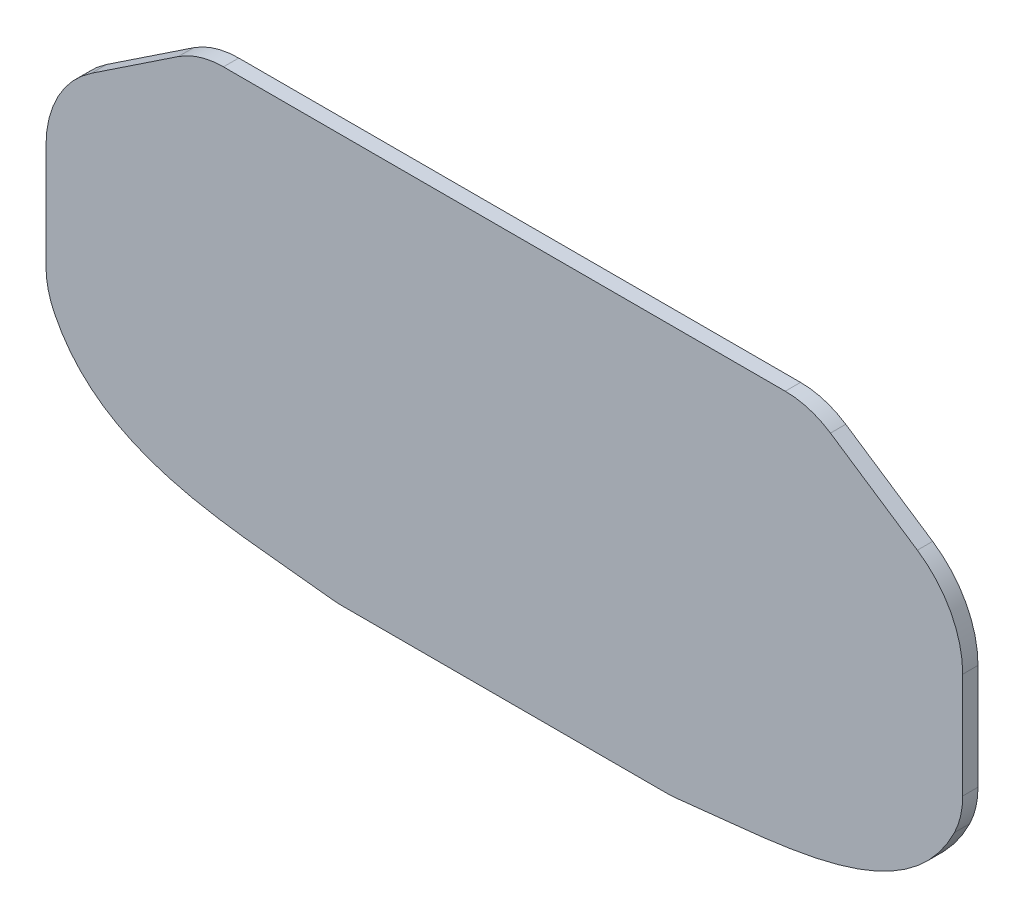
ISO-10303-21;
HEADER;
FILE_DESCRIPTION(('STEP AP214'),'2;1');
FILE_NAME('part.step','',(''),(''),'','','');
FILE_SCHEMA(('AUTOMOTIVE_DESIGN { 1 0 10303 214 1 1 1 1 }'));
ENDSEC;
DATA;
#1=APPLICATION_CONTEXT('core data for automotive mechanical design processes');
#2=APPLICATION_PROTOCOL_DEFINITION('international standard','automotive_design',2000,#1);
#3=PRODUCT_CONTEXT('',#1,'mechanical');
#4=PRODUCT('Part','Part','',(#3));
#5=PRODUCT_RELATED_PRODUCT_CATEGORY('part','',(#4));
#6=PRODUCT_DEFINITION_FORMATION('','',#4);
#7=PRODUCT_DEFINITION_CONTEXT('part definition',#1,'design');
#8=PRODUCT_DEFINITION('design','',#6,#7);
#9=PRODUCT_DEFINITION_SHAPE('','',#8);
#10=(LENGTH_UNIT() NAMED_UNIT(*) SI_UNIT(.MILLI.,.METRE.));
#11=(NAMED_UNIT(*) PLANE_ANGLE_UNIT() SI_UNIT($,.RADIAN.));
#12=(NAMED_UNIT(*) SI_UNIT($,.STERADIAN.) SOLID_ANGLE_UNIT());
#13=UNCERTAINTY_MEASURE_WITH_UNIT(LENGTH_MEASURE(1.E-05),#10,'distance_accuracy_value','');
#14=(GEOMETRIC_REPRESENTATION_CONTEXT(3) GLOBAL_UNCERTAINTY_ASSIGNED_CONTEXT((#13)) GLOBAL_UNIT_ASSIGNED_CONTEXT((#10,
#11,#12)) REPRESENTATION_CONTEXT('',''));
#15=CARTESIAN_POINT('',(0.,0.,0.));
#16=DIRECTION('',(0.,0.,1.));
#17=DIRECTION('',(1.,0.,0.));
#18=AXIS2_PLACEMENT_3D('',#15,#16,#17);
#19=CARTESIAN_POINT('',(0.,0.,3.81));
#20=DIRECTION('',(-1.,0.,0.));
#21=DIRECTION('',(0.,0.,1.));
#22=AXIS2_PLACEMENT_3D('',#19,#20,#21);
#23=PLANE('',#22);
#24=DIRECTION('',(0.,1.,0.));
#25=VECTOR('',#24,1.);
#26=CARTESIAN_POINT('',(0.,0.,0.));
#27=LINE('',#26,#25);
#28=CARTESIAN_POINT('',(0.,36.3067173885473,0.));
#29=VERTEX_POINT('',#28);
#30=CARTESIAN_POINT('',(0.,62.6063325344048,0.));
#31=VERTEX_POINT('',#30);
#32=EDGE_CURVE('E202',#29,#31,#27,.T.);
#33=ORIENTED_EDGE('',*,*,#32,.F.);
#34=DIRECTION('',(0.,0.,1.));
#35=VECTOR('',#34,1.);
#36=CARTESIAN_POINT('',(0.,36.3067173885473,3.81));
#37=LINE('',#36,#35);
#38=CARTESIAN_POINT('',(0.,36.3067173885473,3.81));
#39=VERTEX_POINT('',#38);
#40=EDGE_CURVE('E264',#29,#39,#37,.T.);
#41=ORIENTED_EDGE('',*,*,#40,.T.);
#42=DIRECTION('',(0.,1.,0.));
#43=VECTOR('',#42,1.);
#44=CARTESIAN_POINT('',(0.,0.,3.81));
#45=LINE('',#44,#43);
#46=CARTESIAN_POINT('',(0.,62.6063325344048,3.81));
#47=VERTEX_POINT('',#46);
#48=EDGE_CURVE('E194',#39,#47,#45,.T.);
#49=ORIENTED_EDGE('',*,*,#48,.T.);
#50=DIRECTION('',(0.,0.,-1.));
#51=VECTOR('',#50,1.);
#52=CARTESIAN_POINT('',(0.,62.6063325344048,3.81));
#53=LINE('',#52,#51);
#54=EDGE_CURVE('E238',#47,#31,#53,.T.);
#55=ORIENTED_EDGE('',*,*,#54,.T.);
#56=EDGE_LOOP('',(#33,#41,#49,#55));
#57=FACE_BOUND('',#56,.T.);
#58=ADVANCED_FACE('F47',(#57),#23,.T.);
#59=CARTESIAN_POINT('',(228.6,0.,3.81));
#60=DIRECTION('',(0.,-1.,0.));
#61=DIRECTION('',(0.,0.,-1.));
#62=AXIS2_PLACEMENT_3D('',#59,#60,#61);
#63=PLANE('',#62);
#64=DIRECTION('',(-1.,0.,0.));
#65=VECTOR('',#64,1.);
#66=CARTESIAN_POINT('',(228.6,0.,0.));
#67=LINE('',#66,#65);
#68=CARTESIAN_POINT('',(154.911551716951,0.,0.));
#69=VERTEX_POINT('',#68);
#70=CARTESIAN_POINT('',(73.6884482830485,0.,0.));
#71=VERTEX_POINT('',#70);
#72=EDGE_CURVE('E290',#69,#71,#67,.T.);
#73=ORIENTED_EDGE('',*,*,#72,.F.);
#74=DIRECTION('',(0.,0.,-1.));
#75=VECTOR('',#74,1.);
#76=CARTESIAN_POINT('',(154.911551716951,0.,3.81));
#77=LINE('',#76,#75);
#78=CARTESIAN_POINT('',(154.911551716951,0.,3.81));
#79=VERTEX_POINT('',#78);
#80=EDGE_CURVE('E274',#69,#79,#77,.F.);
#81=ORIENTED_EDGE('',*,*,#80,.T.);
#82=DIRECTION('',(-1.,0.,0.));
#83=VECTOR('',#82,1.);
#84=CARTESIAN_POINT('',(228.6,0.,3.81));
#85=LINE('',#84,#83);
#86=CARTESIAN_POINT('',(73.6884482830485,0.,3.81));
#87=VERTEX_POINT('',#86);
#88=EDGE_CURVE('E199',#79,#87,#85,.T.);
#89=ORIENTED_EDGE('',*,*,#88,.T.);
#90=DIRECTION('',(0.,0.,1.));
#91=VECTOR('',#90,1.);
#92=CARTESIAN_POINT('',(73.6884482830485,0.,3.81));
#93=LINE('',#92,#91);
#94=EDGE_CURVE('E271',#87,#71,#93,.F.);
#95=ORIENTED_EDGE('',*,*,#94,.T.);
#96=EDGE_LOOP('',(#73,#81,#89,#95));
#97=FACE_BOUND('',#96,.T.);
#98=ADVANCED_FACE('F295',(#97),#63,.T.);
#99=CARTESIAN_POINT('',(0.,0.,3.81));
#100=DIRECTION('',(0.,0.,-1.));
#101=DIRECTION('',(-1.,0.,0.));
#102=AXIS2_PLACEMENT_3D('',#99,#100,#101);
#103=PLANE('',#102);
#104=ORIENTED_EDGE('',*,*,#88,.F.);
#105=CARTESIAN_POINT('',(154.911551716951,20.32,3.81));
#106=DIRECTION('',(0.,0.,-1.));
#107=DIRECTION('',(-1.,0.,0.));
#108=AXIS2_PLACEMENT_3D('',#105,#106,#107);
#109=CIRCLE('',#108,20.32);
#110=CARTESIAN_POINT('',(157.543784974881,0.171209761480727,3.81));
#111=VERTEX_POINT('',#110);
#112=EDGE_CURVE('E281',#79,#111,#109,.F.);
#113=ORIENTED_EDGE('',*,*,#112,.T.);
#114=CARTESIAN_POINT('',(228.6,32.4836909668739,3.81));
#115=CARTESIAN_POINT('',(218.54052151117,1.8403987620338,3.81));
#116=CARTESIAN_POINT('',(180.763909957035,3.41703679861688,3.81));
#117=CARTESIAN_POINT('',(156.27521933411,0.,3.81));
#118=B_SPLINE_CURVE_WITH_KNOTS('',3,(#114,#115,#116,#117),.UNSPECIFIED.,.F.,.F.,(4,4),(0.,1.),.UNSPECIFIED.);
#119=CARTESIAN_POINT('',(226.530401820969,27.3722205715367,3.81));
#120=VERTEX_POINT('',#119);
#121=EDGE_CURVE('E305',#120,#111,#118,.T.);
#122=ORIENTED_EDGE('',*,*,#121,.F.);
#123=CARTESIAN_POINT('',(208.28,36.3067173885474,3.81));
#124=DIRECTION('',(0.,0.,-1.));
#125=DIRECTION('',(-1.,0.,0.));
#126=AXIS2_PLACEMENT_3D('',#123,#124,#125);
#127=CIRCLE('',#126,20.32);
#128=CARTESIAN_POINT('',(228.6,36.3067173885474,3.81));
#129=VERTEX_POINT('',#128);
#130=EDGE_CURVE('E252',#120,#129,#127,.F.);
#131=ORIENTED_EDGE('',*,*,#130,.T.);
#132=DIRECTION('',(0.,-1.,0.));
#133=VECTOR('',#132,1.);
#134=CARTESIAN_POINT('',(228.6,76.2,3.81));
#135=LINE('',#134,#133);
#136=CARTESIAN_POINT('',(228.6,62.6063325344049,3.81));
#137=VERTEX_POINT('',#136);
#138=EDGE_CURVE('E408',#137,#129,#135,.T.);
#139=ORIENTED_EDGE('',*,*,#138,.F.);
#140=CARTESIAN_POINT('',(203.2,62.6063325344049,3.81));
#141=DIRECTION('',(0.,0.,-1.));
#142=DIRECTION('',(-1.,0.,0.));
#143=AXIS2_PLACEMENT_3D('',#140,#141,#142);
#144=CIRCLE('',#143,25.4);
#145=CARTESIAN_POINT('',(217.289384984121,83.7404100105861,3.81));
#146=VERTEX_POINT('',#145);
#147=EDGE_CURVE('E235',#137,#146,#144,.F.);
#148=ORIENTED_EDGE('',*,*,#147,.T.);
#149=DIRECTION('',(0.832050294337844,-0.554700196225229,0.));
#150=VECTOR('',#149,1.);
#151=CARTESIAN_POINT('',(190.5,101.6,3.81));
#152=LINE('',#151,#150);
#153=CARTESIAN_POINT('',(195.619107028583,98.1872619809449,3.81));
#154=VERTEX_POINT('',#153);
#155=EDGE_CURVE('E403',#154,#146,#152,.T.);
#156=ORIENTED_EDGE('',*,*,#155,.F.);
#157=CARTESIAN_POINT('',(184.347599041286,81.28,3.81));
#158=DIRECTION('',(0.,0.,-1.));
#159=DIRECTION('',(-1.,0.,0.));
#160=AXIS2_PLACEMENT_3D('',#157,#158,#159);
#161=CIRCLE('',#160,20.32);
#162=CARTESIAN_POINT('',(184.347599041286,101.6,3.81));
#163=VERTEX_POINT('',#162);
#164=EDGE_CURVE('E210',#154,#163,#161,.F.);
#165=ORIENTED_EDGE('',*,*,#164,.T.);
#166=DIRECTION('',(1.,0.,0.));
#167=VECTOR('',#166,1.);
#168=CARTESIAN_POINT('',(38.1,101.6,3.81));
#169=LINE('',#168,#167);
#170=CARTESIAN_POINT('',(44.2524009587141,101.6,3.81));
#171=VERTEX_POINT('',#170);
#172=EDGE_CURVE('E400',#171,#163,#169,.T.);
#173=ORIENTED_EDGE('',*,*,#172,.F.);
#174=CARTESIAN_POINT('',(44.2524009587141,81.28,3.81));
#175=DIRECTION('',(0.,0.,-1.));
#176=DIRECTION('',(-1.,0.,0.));
#177=AXIS2_PLACEMENT_3D('',#174,#175,#176);
#178=CIRCLE('',#177,20.32);
#179=CARTESIAN_POINT('',(32.9808929714175,98.187261980945,3.81));
#180=VERTEX_POINT('',#179);
#181=EDGE_CURVE('E213',#171,#180,#178,.F.);
#182=ORIENTED_EDGE('',*,*,#181,.T.);
#183=DIRECTION('',(0.832050294337843,0.554700196225229,0.));
#184=VECTOR('',#183,1.);
#185=CARTESIAN_POINT('',(0.,76.2,3.81));
#186=LINE('',#185,#184);
#187=CARTESIAN_POINT('',(11.3106150158792,83.7404100105861,3.81));
#188=VERTEX_POINT('',#187);
#189=EDGE_CURVE('E191',#188,#180,#186,.T.);
#190=ORIENTED_EDGE('',*,*,#189,.F.);
#191=CARTESIAN_POINT('',(25.4,62.6063325344048,3.81));
#192=DIRECTION('',(0.,0.,-1.));
#193=DIRECTION('',(-1.,0.,0.));
#194=AXIS2_PLACEMENT_3D('',#191,#192,#193);
#195=CIRCLE('',#194,25.4);
#196=EDGE_CURVE('E231',#188,#47,#195,.F.);
#197=ORIENTED_EDGE('',*,*,#196,.T.);
#198=ORIENTED_EDGE('',*,*,#48,.F.);
#199=CARTESIAN_POINT('',(20.32,36.3067173885473,3.81));
#200=DIRECTION('',(0.,0.,-1.));
#201=DIRECTION('',(-1.,0.,0.));
#202=AXIS2_PLACEMENT_3D('',#199,#200,#201);
#203=CIRCLE('',#202,20.32);
#204=CARTESIAN_POINT('',(2.06959817903115,27.3722205715365,3.81));
#205=VERTEX_POINT('',#204);
#206=EDGE_CURVE('E249',#39,#205,#203,.F.);
#207=ORIENTED_EDGE('',*,*,#206,.T.);
#208=CARTESIAN_POINT('',(0.,32.4836909668739,3.81));
#209=CARTESIAN_POINT('',(10.0594784888304,1.84039876203379,3.81));
#210=CARTESIAN_POINT('',(47.8360900429649,3.41703679861685,3.81));
#211=CARTESIAN_POINT('',(72.3247806658904,0.,3.81));
#212=B_SPLINE_CURVE_WITH_KNOTS('',3,(#208,#209,#210,#211),.UNSPECIFIED.,.F.,.F.,(4,4),(0.,1.),.UNSPECIFIED.);
#213=CARTESIAN_POINT('',(71.0562150251189,0.171209761480717,3.81));
#214=VERTEX_POINT('',#213);
#215=EDGE_CURVE('E309',#205,#214,#212,.T.);
#216=ORIENTED_EDGE('',*,*,#215,.T.);
#217=CARTESIAN_POINT('',(73.6884482830485,20.32,3.81));
#218=DIRECTION('',(0.,0.,-1.));
#219=DIRECTION('',(-1.,0.,0.));
#220=AXIS2_PLACEMENT_3D('',#217,#218,#219);
#221=CIRCLE('',#220,20.32);
#222=EDGE_CURVE('E278',#214,#87,#221,.F.);
#223=ORIENTED_EDGE('',*,*,#222,.T.);
#224=EDGE_LOOP('',(#104,#113,#122,#131,#139,#148,#156,#165,#173,#182,#190,#197,#198,#207,#216,#223));
#225=FACE_BOUND('',#224,.T.);
#226=ADVANCED_FACE('F304',(#225),#103,.F.);
#227=CARTESIAN_POINT('',(0.,0.,0.));
#228=DIRECTION('',(0.,0.,-1.));
#229=DIRECTION('',(-1.,0.,0.));
#230=AXIS2_PLACEMENT_3D('',#227,#228,#229);
#231=PLANE('',#230);
#232=CARTESIAN_POINT('',(228.6,32.4836909668739,0.));
#233=CARTESIAN_POINT('',(218.54052151117,1.8403987620338,0.));
#234=CARTESIAN_POINT('',(180.763909957035,3.41703679861688,0.));
#235=CARTESIAN_POINT('',(156.27521933411,0.,0.));
#236=B_SPLINE_CURVE_WITH_KNOTS('',3,(#232,#233,#234,#235),.UNSPECIFIED.,.F.,.F.,(4,4),(0.,1.),.UNSPECIFIED.);
#237=CARTESIAN_POINT('',(226.530401820969,27.3722205715367,0.));
#238=VERTEX_POINT('',#237);
#239=CARTESIAN_POINT('',(157.543784974881,0.171209761480727,0.));
#240=VERTEX_POINT('',#239);
#241=EDGE_CURVE('E291',#238,#240,#236,.T.);
#242=ORIENTED_EDGE('',*,*,#241,.T.);
#243=CARTESIAN_POINT('',(154.911551716951,20.32,0.));
#244=DIRECTION('',(0.,0.,-1.));
#245=DIRECTION('',(-1.,0.,0.));
#246=AXIS2_PLACEMENT_3D('',#243,#244,#245);
#247=CIRCLE('',#246,20.32);
#248=EDGE_CURVE('E56',#240,#69,#247,.T.);
#249=ORIENTED_EDGE('',*,*,#248,.T.);
#250=ORIENTED_EDGE('',*,*,#72,.T.);
#251=CARTESIAN_POINT('',(73.6884482830485,20.32,0.));
#252=DIRECTION('',(0.,0.,-1.));
#253=DIRECTION('',(-1.,0.,0.));
#254=AXIS2_PLACEMENT_3D('',#251,#252,#253);
#255=CIRCLE('',#254,20.32);
#256=CARTESIAN_POINT('',(71.0562150251189,0.171209761480717,0.));
#257=VERTEX_POINT('',#256);
#258=EDGE_CURVE('E63',#71,#257,#255,.T.);
#259=ORIENTED_EDGE('',*,*,#258,.T.);
#260=CARTESIAN_POINT('',(0.,32.4836909668739,0.));
#261=CARTESIAN_POINT('',(10.0594784888304,1.84039876203379,0.));
#262=CARTESIAN_POINT('',(47.8360900429649,3.41703679861685,0.));
#263=CARTESIAN_POINT('',(72.3247806658904,0.,0.));
#264=B_SPLINE_CURVE_WITH_KNOTS('',3,(#260,#261,#262,#263),.UNSPECIFIED.,.F.,.F.,(4,4),(0.,1.),.UNSPECIFIED.);
#265=CARTESIAN_POINT('',(2.06959817903116,27.3722205715364,0.));
#266=VERTEX_POINT('',#265);
#267=EDGE_CURVE('E176',#266,#257,#264,.T.);
#268=ORIENTED_EDGE('',*,*,#267,.F.);
#269=CARTESIAN_POINT('',(20.32,36.3067173885473,0.));
#270=DIRECTION('',(0.,0.,-1.));
#271=DIRECTION('',(-1.,0.,0.));
#272=AXIS2_PLACEMENT_3D('',#269,#270,#271);
#273=CIRCLE('',#272,20.32);
#274=EDGE_CURVE('E258',#266,#29,#273,.T.);
#275=ORIENTED_EDGE('',*,*,#274,.T.);
#276=ORIENTED_EDGE('',*,*,#32,.T.);
#277=CARTESIAN_POINT('',(25.4,62.6063325344048,0.));
#278=DIRECTION('',(0.,0.,-1.));
#279=DIRECTION('',(-1.,0.,0.));
#280=AXIS2_PLACEMENT_3D('',#277,#278,#279);
#281=CIRCLE('',#280,25.4);
#282=CARTESIAN_POINT('',(11.3106150158792,83.7404100105861,0.));
#283=VERTEX_POINT('',#282);
#284=EDGE_CURVE('E170',#31,#283,#281,.T.);
#285=ORIENTED_EDGE('',*,*,#284,.T.);
#286=DIRECTION('',(0.832050294337843,0.554700196225229,0.));
#287=VECTOR('',#286,1.);
#288=CARTESIAN_POINT('',(0.,76.2,0.));
#289=LINE('',#288,#287);
#290=CARTESIAN_POINT('',(32.9808929714175,98.187261980945,0.));
#291=VERTEX_POINT('',#290);
#292=EDGE_CURVE('E163',#283,#291,#289,.T.);
#293=ORIENTED_EDGE('',*,*,#292,.T.);
#294=CARTESIAN_POINT('',(44.2524009587141,81.28,0.));
#295=DIRECTION('',(0.,0.,-1.));
#296=DIRECTION('',(-1.,0.,0.));
#297=AXIS2_PLACEMENT_3D('',#294,#295,#296);
#298=CIRCLE('',#297,20.32);
#299=CARTESIAN_POINT('',(44.2524009587141,101.6,0.));
#300=VERTEX_POINT('',#299);
#301=EDGE_CURVE('E167',#291,#300,#298,.T.);
#302=ORIENTED_EDGE('',*,*,#301,.T.);
#303=DIRECTION('',(1.,0.,0.));
#304=VECTOR('',#303,1.);
#305=CARTESIAN_POINT('',(38.1,101.6,0.));
#306=LINE('',#305,#304);
#307=CARTESIAN_POINT('',(184.347599041286,101.6,0.));
#308=VERTEX_POINT('',#307);
#309=EDGE_CURVE('E175',#300,#308,#306,.T.);
#310=ORIENTED_EDGE('',*,*,#309,.T.);
#311=CARTESIAN_POINT('',(184.347599041286,81.28,0.));
#312=DIRECTION('',(0.,0.,-1.));
#313=DIRECTION('',(-1.,0.,0.));
#314=AXIS2_PLACEMENT_3D('',#311,#312,#313);
#315=CIRCLE('',#314,20.32);
#316=CARTESIAN_POINT('',(195.619107028583,98.1872619809449,0.));
#317=VERTEX_POINT('',#316);
#318=EDGE_CURVE('E187',#308,#317,#315,.T.);
#319=ORIENTED_EDGE('',*,*,#318,.T.);
#320=DIRECTION('',(0.832050294337844,-0.554700196225229,0.));
#321=VECTOR('',#320,1.);
#322=CARTESIAN_POINT('',(190.5,101.6,0.));
#323=LINE('',#322,#321);
#324=CARTESIAN_POINT('',(217.289384984121,83.7404100105861,0.));
#325=VERTEX_POINT('',#324);
#326=EDGE_CURVE('E418',#317,#325,#323,.T.);
#327=ORIENTED_EDGE('',*,*,#326,.T.);
#328=CARTESIAN_POINT('',(203.2,62.6063325344049,0.));
#329=DIRECTION('',(0.,0.,-1.));
#330=DIRECTION('',(-1.,0.,0.));
#331=AXIS2_PLACEMENT_3D('',#328,#329,#330);
#332=CIRCLE('',#331,25.4);
#333=CARTESIAN_POINT('',(228.6,62.6063325344049,0.));
#334=VERTEX_POINT('',#333);
#335=EDGE_CURVE('E225',#325,#334,#332,.T.);
#336=ORIENTED_EDGE('',*,*,#335,.T.);
#337=DIRECTION('',(0.,-1.,0.));
#338=VECTOR('',#337,1.);
#339=CARTESIAN_POINT('',(228.6,76.2,0.));
#340=LINE('',#339,#338);
#341=CARTESIAN_POINT('',(228.6,36.3067173885474,0.));
#342=VERTEX_POINT('',#341);
#343=EDGE_CURVE('E300',#334,#342,#340,.T.);
#344=ORIENTED_EDGE('',*,*,#343,.T.);
#345=CARTESIAN_POINT('',(208.28,36.3067173885474,0.));
#346=DIRECTION('',(0.,0.,-1.));
#347=DIRECTION('',(-1.,0.,0.));
#348=AXIS2_PLACEMENT_3D('',#345,#346,#347);
#349=CIRCLE('',#348,20.32);
#350=EDGE_CURVE('E261',#342,#238,#349,.T.);
#351=ORIENTED_EDGE('',*,*,#350,.T.);
#352=EDGE_LOOP('',(#242,#249,#250,#259,#268,#275,#276,#285,#293,#302,#310,#319,#327,#336,#344,#351));
#353=FACE_BOUND('',#352,.T.);
#354=ADVANCED_FACE('F165',(#353),#231,.T.);
#355=CARTESIAN_POINT('',(0.,76.2,3.81));
#356=DIRECTION('',(-0.554700196225229,0.832050294337844,0.));
#357=DIRECTION('',(-0.832050294337844,-0.554700196225229,0.));
#358=AXIS2_PLACEMENT_3D('',#355,#356,#357);
#359=PLANE('',#358);
#360=ORIENTED_EDGE('',*,*,#292,.F.);
#361=DIRECTION('',(0.,0.,-1.));
#362=VECTOR('',#361,1.);
#363=CARTESIAN_POINT('',(11.3106150158792,83.7404100105861,3.81));
#364=LINE('',#363,#362);
#365=EDGE_CURVE('E242',#283,#188,#364,.F.);
#366=ORIENTED_EDGE('',*,*,#365,.T.);
#367=ORIENTED_EDGE('',*,*,#189,.T.);
#368=DIRECTION('',(0.,0.,-1.));
#369=VECTOR('',#368,1.);
#370=CARTESIAN_POINT('',(32.9808929714175,98.187261980945,3.81));
#371=LINE('',#370,#369);
#372=EDGE_CURVE('E183',#180,#291,#371,.T.);
#373=ORIENTED_EDGE('',*,*,#372,.T.);
#374=EDGE_LOOP('',(#360,#366,#367,#373));
#375=FACE_BOUND('',#374,.T.);
#376=ADVANCED_FACE('F189',(#375),#359,.T.);
#377=CARTESIAN_POINT('',(228.6,76.2,3.81));
#378=DIRECTION('',(1.,0.,0.));
#379=DIRECTION('',(0.,0.,-1.));
#380=AXIS2_PLACEMENT_3D('',#377,#378,#379);
#381=PLANE('',#380);
#382=ORIENTED_EDGE('',*,*,#138,.T.);
#383=DIRECTION('',(0.,0.,-1.));
#384=VECTOR('',#383,1.);
#385=CARTESIAN_POINT('',(228.6,36.3067173885474,0.));
#386=LINE('',#385,#384);
#387=EDGE_CURVE('E255',#129,#342,#386,.T.);
#388=ORIENTED_EDGE('',*,*,#387,.T.);
#389=ORIENTED_EDGE('',*,*,#343,.F.);
#390=DIRECTION('',(0.,0.,-1.));
#391=VECTOR('',#390,1.);
#392=CARTESIAN_POINT('',(228.6,62.6063325344049,3.81));
#393=LINE('',#392,#391);
#394=EDGE_CURVE('E228',#334,#137,#393,.F.);
#395=ORIENTED_EDGE('',*,*,#394,.T.);
#396=EDGE_LOOP('',(#382,#388,#389,#395));
#397=FACE_BOUND('',#396,.T.);
#398=ADVANCED_FACE('F347',(#397),#381,.T.);
#399=CARTESIAN_POINT('',(190.5,101.6,3.81));
#400=DIRECTION('',(0.554700196225229,0.832050294337843,0.));
#401=DIRECTION('',(-0.832050294337844,0.554700196225229,0.));
#402=AXIS2_PLACEMENT_3D('',#399,#400,#401);
#403=PLANE('',#402);
#404=ORIENTED_EDGE('',*,*,#155,.T.);
#405=DIRECTION('',(0.,0.,-1.));
#406=VECTOR('',#405,1.);
#407=CARTESIAN_POINT('',(217.289384984121,83.7404100105861,3.81));
#408=LINE('',#407,#406);
#409=EDGE_CURVE('E219',#146,#325,#408,.T.);
#410=ORIENTED_EDGE('',*,*,#409,.T.);
#411=ORIENTED_EDGE('',*,*,#326,.F.);
#412=DIRECTION('',(0.,0.,-1.));
#413=VECTOR('',#412,1.);
#414=CARTESIAN_POINT('',(195.619107028583,98.1872619809449,3.81));
#415=LINE('',#414,#413);
#416=EDGE_CURVE('E216',#317,#154,#415,.F.);
#417=ORIENTED_EDGE('',*,*,#416,.T.);
#418=EDGE_LOOP('',(#404,#410,#411,#417));
#419=FACE_BOUND('',#418,.T.);
#420=ADVANCED_FACE('F350',(#419),#403,.T.);
#421=CARTESIAN_POINT('',(38.1,101.6,3.81));
#422=DIRECTION('',(0.,1.,0.));
#423=DIRECTION('',(0.,0.,1.));
#424=AXIS2_PLACEMENT_3D('',#421,#422,#423);
#425=PLANE('',#424);
#426=ORIENTED_EDGE('',*,*,#309,.F.);
#427=DIRECTION('',(0.,0.,-1.));
#428=VECTOR('',#427,1.);
#429=CARTESIAN_POINT('',(44.2524009587141,101.6,3.81));
#430=LINE('',#429,#428);
#431=EDGE_CURVE('E184',#300,#171,#430,.F.);
#432=ORIENTED_EDGE('',*,*,#431,.T.);
#433=ORIENTED_EDGE('',*,*,#172,.T.);
#434=DIRECTION('',(0.,0.,-1.));
#435=VECTOR('',#434,1.);
#436=CARTESIAN_POINT('',(184.347599041286,101.6,3.81));
#437=LINE('',#436,#435);
#438=EDGE_CURVE('E186',#163,#308,#437,.T.);
#439=ORIENTED_EDGE('',*,*,#438,.T.);
#440=EDGE_LOOP('',(#426,#432,#433,#439));
#441=FACE_BOUND('',#440,.T.);
#442=ADVANCED_FACE('F354',(#441),#425,.T.);
#443=CARTESIAN_POINT('',(44.2524009587141,81.28,3.81));
#444=DIRECTION('',(0.,0.,-1.));
#445=DIRECTION('',(-1.,0.,0.));
#446=AXIS2_PLACEMENT_3D('',#443,#444,#445);
#447=CYLINDRICAL_SURFACE('',#446,20.32);
#448=ORIENTED_EDGE('',*,*,#181,.F.);
#449=ORIENTED_EDGE('',*,*,#431,.F.);
#450=ORIENTED_EDGE('',*,*,#301,.F.);
#451=ORIENTED_EDGE('',*,*,#372,.F.);
#452=EDGE_LOOP('',(#448,#449,#450,#451));
#453=FACE_BOUND('',#452,.T.);
#454=ADVANCED_FACE('F182',(#453),#447,.T.);
#455=CARTESIAN_POINT('',(184.347599041286,81.28,3.81));
#456=DIRECTION('',(0.,0.,-1.));
#457=DIRECTION('',(-1.,0.,0.));
#458=AXIS2_PLACEMENT_3D('',#455,#456,#457);
#459=CYLINDRICAL_SURFACE('',#458,20.32);
#460=ORIENTED_EDGE('',*,*,#164,.F.);
#461=ORIENTED_EDGE('',*,*,#416,.F.);
#462=ORIENTED_EDGE('',*,*,#318,.F.);
#463=ORIENTED_EDGE('',*,*,#438,.F.);
#464=EDGE_LOOP('',(#460,#461,#462,#463));
#465=FACE_BOUND('',#464,.T.);
#466=ADVANCED_FACE('F363',(#465),#459,.T.);
#467=CARTESIAN_POINT('',(203.2,62.6063325344049,3.81));
#468=DIRECTION('',(0.,0.,-1.));
#469=DIRECTION('',(-1.,0.,0.));
#470=AXIS2_PLACEMENT_3D('',#467,#468,#469);
#471=CYLINDRICAL_SURFACE('',#470,25.4);
#472=ORIENTED_EDGE('',*,*,#147,.F.);
#473=ORIENTED_EDGE('',*,*,#394,.F.);
#474=ORIENTED_EDGE('',*,*,#335,.F.);
#475=ORIENTED_EDGE('',*,*,#409,.F.);
#476=EDGE_LOOP('',(#472,#473,#474,#475));
#477=FACE_BOUND('',#476,.T.);
#478=ADVANCED_FACE('F366',(#477),#471,.T.);
#479=CARTESIAN_POINT('',(25.4,62.6063325344048,3.81));
#480=DIRECTION('',(0.,0.,-1.));
#481=DIRECTION('',(-1.,0.,0.));
#482=AXIS2_PLACEMENT_3D('',#479,#480,#481);
#483=CYLINDRICAL_SURFACE('',#482,25.4);
#484=ORIENTED_EDGE('',*,*,#196,.F.);
#485=ORIENTED_EDGE('',*,*,#365,.F.);
#486=ORIENTED_EDGE('',*,*,#284,.F.);
#487=ORIENTED_EDGE('',*,*,#54,.F.);
#488=EDGE_LOOP('',(#484,#485,#486,#487));
#489=FACE_BOUND('',#488,.T.);
#490=ADVANCED_FACE('F337',(#489),#483,.T.);
#491=DIRECTION('',(0.,0.,1.));
#492=VECTOR('',#491,1.);
#493=SURFACE_OF_LINEAR_EXTRUSION('',#236,#492);
#494=ORIENTED_EDGE('',*,*,#121,.T.);
#495=DIRECTION('',(0.,0.,1.));
#496=VECTOR('',#495,1.);
#497=CARTESIAN_POINT('',(157.543784974872,0.171209761479561,3.81));
#498=LINE('',#497,#496);
#499=EDGE_CURVE('E71',#111,#240,#498,.F.);
#500=ORIENTED_EDGE('',*,*,#499,.T.);
#501=ORIENTED_EDGE('',*,*,#241,.F.);
#502=DIRECTION('',(0.,0.,1.));
#503=VECTOR('',#502,1.);
#504=CARTESIAN_POINT('',(226.530401820969,27.3722205715366,0.));
#505=LINE('',#504,#503);
#506=EDGE_CURVE('E245',#238,#120,#505,.T.);
#507=ORIENTED_EDGE('',*,*,#506,.T.);
#508=EDGE_LOOP('',(#494,#500,#501,#507));
#509=FACE_BOUND('',#508,.T.);
#510=ADVANCED_FACE('F306',(#509),#493,.F.);
#511=DIRECTION('',(0.,0.,1.));
#512=VECTOR('',#511,1.);
#513=SURFACE_OF_LINEAR_EXTRUSION('',#264,#512);
#514=ORIENTED_EDGE('',*,*,#267,.T.);
#515=DIRECTION('',(0.,0.,1.));
#516=VECTOR('',#515,1.);
#517=CARTESIAN_POINT('',(71.0562150251279,0.171209761479553,0.));
#518=LINE('',#517,#516);
#519=EDGE_CURVE('E11',#257,#214,#518,.T.);
#520=ORIENTED_EDGE('',*,*,#519,.T.);
#521=ORIENTED_EDGE('',*,*,#215,.F.);
#522=DIRECTION('',(0.,0.,1.));
#523=VECTOR('',#522,1.);
#524=CARTESIAN_POINT('',(2.06959817903116,27.3722205715365,3.81));
#525=LINE('',#524,#523);
#526=EDGE_CURVE('E268',#205,#266,#525,.F.);
#527=ORIENTED_EDGE('',*,*,#526,.T.);
#528=EDGE_LOOP('',(#514,#520,#521,#527));
#529=FACE_BOUND('',#528,.T.);
#530=ADVANCED_FACE('F336',(#529),#513,.T.);
#531=CARTESIAN_POINT('',(208.28,36.3067173885474,1.905));
#532=DIRECTION('',(0.,0.,1.));
#533=DIRECTION('',(1.,0.,0.));
#534=AXIS2_PLACEMENT_3D('',#531,#532,#533);
#535=CYLINDRICAL_SURFACE('',#534,20.32);
#536=ORIENTED_EDGE('',*,*,#350,.F.);
#537=ORIENTED_EDGE('',*,*,#387,.F.);
#538=ORIENTED_EDGE('',*,*,#130,.F.);
#539=ORIENTED_EDGE('',*,*,#506,.F.);
#540=EDGE_LOOP('',(#536,#537,#538,#539));
#541=FACE_BOUND('',#540,.T.);
#542=ADVANCED_FACE('F374',(#541),#535,.T.);
#543=CARTESIAN_POINT('',(20.32,36.3067173885473,1.905));
#544=DIRECTION('',(0.,0.,1.));
#545=DIRECTION('',(1.,0.,0.));
#546=AXIS2_PLACEMENT_3D('',#543,#544,#545);
#547=CYLINDRICAL_SURFACE('',#546,20.32);
#548=ORIENTED_EDGE('',*,*,#274,.F.);
#549=ORIENTED_EDGE('',*,*,#526,.F.);
#550=ORIENTED_EDGE('',*,*,#206,.F.);
#551=ORIENTED_EDGE('',*,*,#40,.F.);
#552=EDGE_LOOP('',(#548,#549,#550,#551));
#553=FACE_BOUND('',#552,.T.);
#554=ADVANCED_FACE('F377',(#553),#547,.T.);
#555=CARTESIAN_POINT('',(154.911551716951,20.32,1.905));
#556=DIRECTION('',(0.,0.,1.));
#557=DIRECTION('',(1.,0.,0.));
#558=AXIS2_PLACEMENT_3D('',#555,#556,#557);
#559=CYLINDRICAL_SURFACE('',#558,20.32);
#560=ORIENTED_EDGE('',*,*,#248,.F.);
#561=ORIENTED_EDGE('',*,*,#499,.F.);
#562=ORIENTED_EDGE('',*,*,#112,.F.);
#563=ORIENTED_EDGE('',*,*,#80,.F.);
#564=EDGE_LOOP('',(#560,#561,#562,#563));
#565=FACE_BOUND('',#564,.T.);
#566=ADVANCED_FACE('F301',(#565),#559,.T.);
#567=CARTESIAN_POINT('',(73.6884482830485,20.32,1.905));
#568=DIRECTION('',(0.,0.,1.));
#569=DIRECTION('',(1.,0.,0.));
#570=AXIS2_PLACEMENT_3D('',#567,#568,#569);
#571=CYLINDRICAL_SURFACE('',#570,20.32);
#572=ORIENTED_EDGE('',*,*,#258,.F.);
#573=ORIENTED_EDGE('',*,*,#94,.F.);
#574=ORIENTED_EDGE('',*,*,#222,.F.);
#575=ORIENTED_EDGE('',*,*,#519,.F.);
#576=EDGE_LOOP('',(#572,#573,#574,#575));
#577=FACE_BOUND('',#576,.T.);
#578=ADVANCED_FACE('F49',(#577),#571,.T.);
#579=CLOSED_SHELL('',(#58,#98,#226,#354,#376,#398,#420,#442,#454,#466,#478,#490,#510,#530,#542,
#554,#566,#578));
#580=MANIFOLD_SOLID_BREP('B2',#579);
#581=ADVANCED_BREP_SHAPE_REPRESENTATION('',(#18,#580),#14);
#582=SHAPE_DEFINITION_REPRESENTATION(#9,#581);
ENDSEC;
END-ISO-10303-21;
